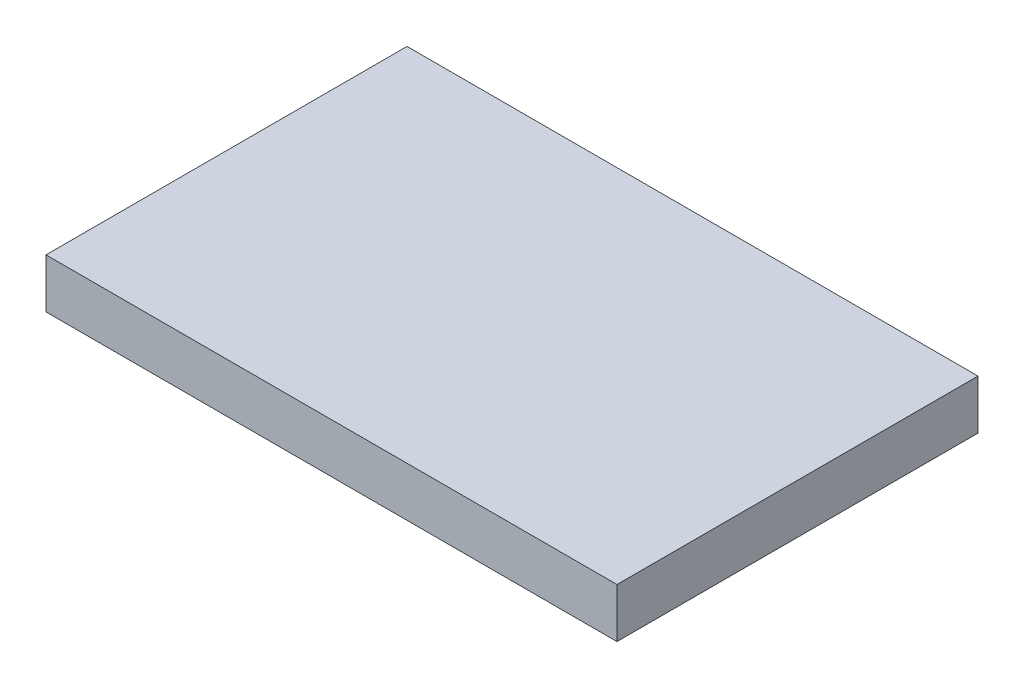
ISO-10303-21;
HEADER;
FILE_DESCRIPTION(('STEP AP214'),'2;1');
FILE_NAME('part.step','',(''),(''),'','','');
FILE_SCHEMA(('AUTOMOTIVE_DESIGN { 1 0 10303 214 1 1 1 1 }'));
ENDSEC;
DATA;
#1=APPLICATION_CONTEXT('core data for automotive mechanical design processes');
#2=APPLICATION_PROTOCOL_DEFINITION('international standard','automotive_design',2000,#1);
#3=PRODUCT_CONTEXT('',#1,'mechanical');
#4=PRODUCT('Part','Part','',(#3));
#5=PRODUCT_RELATED_PRODUCT_CATEGORY('part','',(#4));
#6=PRODUCT_DEFINITION_FORMATION('','',#4);
#7=PRODUCT_DEFINITION_CONTEXT('part definition',#1,'design');
#8=PRODUCT_DEFINITION('design','',#6,#7);
#9=PRODUCT_DEFINITION_SHAPE('','',#8);
#10=(LENGTH_UNIT() NAMED_UNIT(*) SI_UNIT(.MILLI.,.METRE.));
#11=(NAMED_UNIT(*) PLANE_ANGLE_UNIT() SI_UNIT($,.RADIAN.));
#12=(NAMED_UNIT(*) SI_UNIT($,.STERADIAN.) SOLID_ANGLE_UNIT());
#13=UNCERTAINTY_MEASURE_WITH_UNIT(LENGTH_MEASURE(1.E-05),#10,'distance_accuracy_value','');
#14=(GEOMETRIC_REPRESENTATION_CONTEXT(3) GLOBAL_UNCERTAINTY_ASSIGNED_CONTEXT((#13)) GLOBAL_UNIT_ASSIGNED_CONTEXT((#10,
#11,#12)) REPRESENTATION_CONTEXT('',''));
#15=CARTESIAN_POINT('',(0.,0.,0.));
#16=DIRECTION('',(0.,0.,1.));
#17=DIRECTION('',(1.,0.,0.));
#18=AXIS2_PLACEMENT_3D('',#15,#16,#17);
#19=CARTESIAN_POINT('',(0.,10.,0.));
#20=DIRECTION('',(1.,0.,0.));
#21=DIRECTION('',(0.,0.,-1.));
#22=AXIS2_PLACEMENT_3D('',#19,#20,#21);
#23=PLANE('',#22);
#24=DIRECTION('',(0.,0.,1.));
#25=VECTOR('',#24,1.);
#26=CARTESIAN_POINT('',(0.,0.,0.));
#27=LINE('',#26,#25);
#28=CARTESIAN_POINT('',(0.,0.,-73.0409827560055));
#29=VERTEX_POINT('',#28);
#30=CARTESIAN_POINT('',(0.,0.,0.));
#31=VERTEX_POINT('',#30);
#32=EDGE_CURVE('E105',#29,#31,#27,.T.);
#33=ORIENTED_EDGE('',*,*,#32,.T.);
#34=DIRECTION('',(0.,-1.,0.));
#35=VECTOR('',#34,1.);
#36=CARTESIAN_POINT('',(0.,10.,0.));
#37=LINE('',#36,#35);
#38=CARTESIAN_POINT('',(0.,10.,0.));
#39=VERTEX_POINT('',#38);
#40=EDGE_CURVE('E11',#39,#31,#37,.T.);
#41=ORIENTED_EDGE('',*,*,#40,.F.);
#42=DIRECTION('',(0.,0.,1.));
#43=VECTOR('',#42,1.);
#44=CARTESIAN_POINT('',(0.,10.,0.));
#45=LINE('',#44,#43);
#46=CARTESIAN_POINT('',(0.,10.,-73.0409827560055));
#47=VERTEX_POINT('',#46);
#48=EDGE_CURVE('E89',#47,#39,#45,.T.);
#49=ORIENTED_EDGE('',*,*,#48,.F.);
#50=DIRECTION('',(0.,-1.,0.));
#51=VECTOR('',#50,1.);
#52=CARTESIAN_POINT('',(0.,10.,-73.0409827560055));
#53=LINE('',#52,#51);
#54=EDGE_CURVE('E97',#47,#29,#53,.T.);
#55=ORIENTED_EDGE('',*,*,#54,.T.);
#56=EDGE_LOOP('',(#33,#41,#49,#55));
#57=FACE_BOUND('',#56,.T.);
#58=ADVANCED_FACE('F39',(#57),#23,.F.);
#59=CARTESIAN_POINT('',(0.,10.,0.));
#60=DIRECTION('',(0.,0.,-1.));
#61=DIRECTION('',(-1.,0.,0.));
#62=AXIS2_PLACEMENT_3D('',#59,#60,#61);
#63=PLANE('',#62);
#64=DIRECTION('',(1.,0.,0.));
#65=VECTOR('',#64,1.);
#66=CARTESIAN_POINT('',(0.,0.,0.));
#67=LINE('',#66,#65);
#68=CARTESIAN_POINT('',(115.51971169088,0.,0.));
#69=VERTEX_POINT('',#68);
#70=EDGE_CURVE('E92',#31,#69,#67,.T.);
#71=ORIENTED_EDGE('',*,*,#70,.T.);
#72=DIRECTION('',(0.,-1.,0.));
#73=VECTOR('',#72,1.);
#74=CARTESIAN_POINT('',(115.51971169088,10.,0.));
#75=LINE('',#74,#73);
#76=CARTESIAN_POINT('',(115.51971169088,10.,0.));
#77=VERTEX_POINT('',#76);
#78=EDGE_CURVE('E50',#77,#69,#75,.T.);
#79=ORIENTED_EDGE('',*,*,#78,.F.);
#80=DIRECTION('',(1.,0.,0.));
#81=VECTOR('',#80,1.);
#82=CARTESIAN_POINT('',(0.,10.,0.));
#83=LINE('',#82,#81);
#84=EDGE_CURVE('E82',#39,#77,#83,.T.);
#85=ORIENTED_EDGE('',*,*,#84,.F.);
#86=ORIENTED_EDGE('',*,*,#40,.T.);
#87=EDGE_LOOP('',(#71,#79,#85,#86));
#88=FACE_BOUND('',#87,.T.);
#89=ADVANCED_FACE('F93',(#88),#63,.F.);
#90=CARTESIAN_POINT('',(115.51971169088,10.,0.));
#91=DIRECTION('',(-1.,0.,0.));
#92=DIRECTION('',(0.,0.,1.));
#93=AXIS2_PLACEMENT_3D('',#90,#91,#92);
#94=PLANE('',#93);
#95=DIRECTION('',(0.,0.,-1.));
#96=VECTOR('',#95,1.);
#97=CARTESIAN_POINT('',(115.51971169088,0.,0.));
#98=LINE('',#97,#96);
#99=CARTESIAN_POINT('',(115.51971169088,0.,-73.0409827560055));
#100=VERTEX_POINT('',#99);
#101=EDGE_CURVE('E74',#69,#100,#98,.T.);
#102=ORIENTED_EDGE('',*,*,#101,.T.);
#103=DIRECTION('',(0.,-1.,0.));
#104=VECTOR('',#103,1.);
#105=CARTESIAN_POINT('',(115.51971169088,10.,-73.0409827560055));
#106=LINE('',#105,#104);
#107=CARTESIAN_POINT('',(115.51971169088,10.,-73.0409827560055));
#108=VERTEX_POINT('',#107);
#109=EDGE_CURVE('E94',#108,#100,#106,.T.);
#110=ORIENTED_EDGE('',*,*,#109,.F.);
#111=DIRECTION('',(0.,0.,-1.));
#112=VECTOR('',#111,1.);
#113=CARTESIAN_POINT('',(115.51971169088,10.,0.));
#114=LINE('',#113,#112);
#115=EDGE_CURVE('E88',#77,#108,#114,.T.);
#116=ORIENTED_EDGE('',*,*,#115,.F.);
#117=ORIENTED_EDGE('',*,*,#78,.T.);
#118=EDGE_LOOP('',(#102,#110,#116,#117));
#119=FACE_BOUND('',#118,.T.);
#120=ADVANCED_FACE('F96',(#119),#94,.F.);
#121=CARTESIAN_POINT('',(0.,10.,-73.0409827560055));
#122=DIRECTION('',(0.,0.,1.));
#123=DIRECTION('',(1.,0.,0.));
#124=AXIS2_PLACEMENT_3D('',#121,#122,#123);
#125=PLANE('',#124);
#126=DIRECTION('',(-1.,0.,0.));
#127=VECTOR('',#126,1.);
#128=CARTESIAN_POINT('',(0.,0.,-73.0409827560055));
#129=LINE('',#128,#127);
#130=EDGE_CURVE('E76',#100,#29,#129,.T.);
#131=ORIENTED_EDGE('',*,*,#130,.T.);
#132=ORIENTED_EDGE('',*,*,#54,.F.);
#133=DIRECTION('',(-1.,0.,0.));
#134=VECTOR('',#133,1.);
#135=CARTESIAN_POINT('',(0.,10.,-73.0409827560055));
#136=LINE('',#135,#134);
#137=EDGE_CURVE('E54',#108,#47,#136,.T.);
#138=ORIENTED_EDGE('',*,*,#137,.F.);
#139=ORIENTED_EDGE('',*,*,#109,.T.);
#140=EDGE_LOOP('',(#131,#132,#138,#139));
#141=FACE_BOUND('',#140,.T.);
#142=ADVANCED_FACE('F106',(#141),#125,.F.);
#143=CARTESIAN_POINT('',(0.,10.,0.));
#144=DIRECTION('',(0.,-1.,0.));
#145=DIRECTION('',(0.,0.,-1.));
#146=AXIS2_PLACEMENT_3D('',#143,#144,#145);
#147=PLANE('',#146);
#148=ORIENTED_EDGE('',*,*,#48,.T.);
#149=ORIENTED_EDGE('',*,*,#84,.T.);
#150=ORIENTED_EDGE('',*,*,#115,.T.);
#151=ORIENTED_EDGE('',*,*,#137,.T.);
#152=EDGE_LOOP('',(#148,#149,#150,#151));
#153=FACE_BOUND('',#152,.T.);
#154=ADVANCED_FACE('F86',(#153),#147,.F.);
#155=CARTESIAN_POINT('',(0.,0.,0.));
#156=DIRECTION('',(0.,-1.,0.));
#157=DIRECTION('',(0.,0.,-1.));
#158=AXIS2_PLACEMENT_3D('',#155,#156,#157);
#159=PLANE('',#158);
#160=ORIENTED_EDGE('',*,*,#32,.F.);
#161=ORIENTED_EDGE('',*,*,#130,.F.);
#162=ORIENTED_EDGE('',*,*,#101,.F.);
#163=ORIENTED_EDGE('',*,*,#70,.F.);
#164=EDGE_LOOP('',(#160,#161,#162,#163));
#165=FACE_BOUND('',#164,.T.);
#166=ADVANCED_FACE('F115',(#165),#159,.T.);
#167=CLOSED_SHELL('',(#58,#89,#120,#142,#154,#166));
#168=MANIFOLD_SOLID_BREP('B2',#167);
#169=ADVANCED_BREP_SHAPE_REPRESENTATION('',(#18,#168),#14);
#170=SHAPE_DEFINITION_REPRESENTATION(#9,#169);
ENDSEC;
END-ISO-10303-21;
